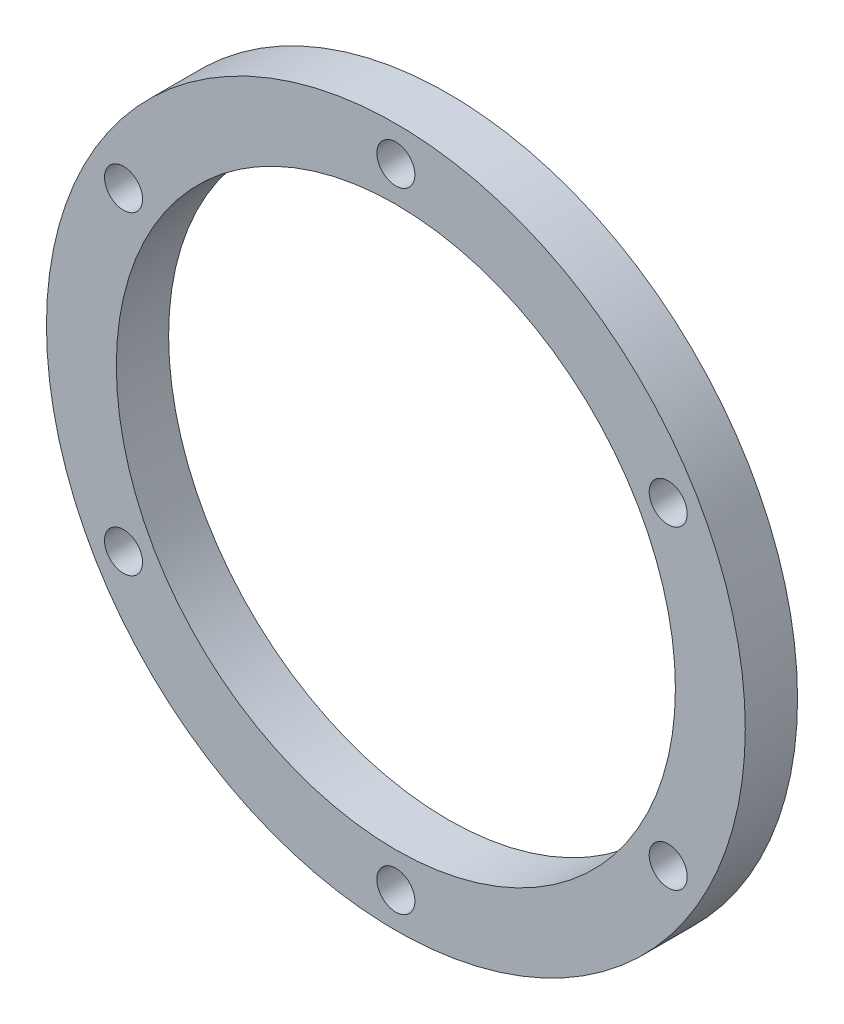
ISO-10303-21;
HEADER;
FILE_DESCRIPTION(('STEP AP214'),'2;1');
FILE_NAME('part.step','',(''),(''),'','','');
FILE_SCHEMA(('AUTOMOTIVE_DESIGN { 1 0 10303 214 1 1 1 1 }'));
ENDSEC;
DATA;
#1=APPLICATION_CONTEXT('core data for automotive mechanical design processes');
#2=APPLICATION_PROTOCOL_DEFINITION('international standard','automotive_design',2000,#1);
#3=PRODUCT_CONTEXT('',#1,'mechanical');
#4=PRODUCT('Part','Part','',(#3));
#5=PRODUCT_RELATED_PRODUCT_CATEGORY('part','',(#4));
#6=PRODUCT_DEFINITION_FORMATION('','',#4);
#7=PRODUCT_DEFINITION_CONTEXT('part definition',#1,'design');
#8=PRODUCT_DEFINITION('design','',#6,#7);
#9=PRODUCT_DEFINITION_SHAPE('','',#8);
#10=(LENGTH_UNIT() NAMED_UNIT(*) SI_UNIT(.MILLI.,.METRE.));
#11=(NAMED_UNIT(*) PLANE_ANGLE_UNIT() SI_UNIT($,.RADIAN.));
#12=(NAMED_UNIT(*) SI_UNIT($,.STERADIAN.) SOLID_ANGLE_UNIT());
#13=UNCERTAINTY_MEASURE_WITH_UNIT(LENGTH_MEASURE(1.E-05),#10,'distance_accuracy_value','');
#14=(GEOMETRIC_REPRESENTATION_CONTEXT(3) GLOBAL_UNCERTAINTY_ASSIGNED_CONTEXT((#13)) GLOBAL_UNIT_ASSIGNED_CONTEXT((#10,
#11,#12)) REPRESENTATION_CONTEXT('',''));
#15=CARTESIAN_POINT('',(0.,0.,0.));
#16=DIRECTION('',(0.,0.,1.));
#17=DIRECTION('',(1.,0.,0.));
#18=AXIS2_PLACEMENT_3D('',#15,#16,#17);
#19=CARTESIAN_POINT('',(0.,0.,4.7498));
#20=DIRECTION('',(0.,0.,1.));
#21=DIRECTION('',(1.,0.,0.));
#22=AXIS2_PLACEMENT_3D('',#19,#20,#21);
#23=PLANE('',#22);
#24=CARTESIAN_POINT('',(0.,28.575,4.7498));
#25=DIRECTION('',(0.,0.,1.));
#26=DIRECTION('',(1.,0.,0.));
#27=AXIS2_PLACEMENT_3D('',#24,#25,#26);
#28=CIRCLE('',#27,1.72719999999999);
#29=CARTESIAN_POINT('',(1.72719999999999,28.575,4.7498));
#30=VERTEX_POINT('',#29);
#31=EDGE_CURVE('E83',#30,#30,#28,.T.);
#32=ORIENTED_EDGE('',*,*,#31,.F.);
#33=EDGE_LOOP('',(#32));
#34=FACE_BOUND('',#33,.T.);
#35=CARTESIAN_POINT('',(24.7466759131404,14.2874999999999,4.7498));
#36=DIRECTION('',(0.,0.,1.));
#37=DIRECTION('',(1.,0.,0.));
#38=AXIS2_PLACEMENT_3D('',#35,#36,#37);
#39=CIRCLE('',#38,1.72719999999999);
#40=CARTESIAN_POINT('',(26.4738759131404,14.2874999999999,4.7498));
#41=VERTEX_POINT('',#40);
#42=EDGE_CURVE('E77',#41,#41,#39,.T.);
#43=ORIENTED_EDGE('',*,*,#42,.F.);
#44=EDGE_LOOP('',(#43));
#45=FACE_BOUND('',#44,.T.);
#46=CARTESIAN_POINT('',(24.7466759131403,-14.2875000000001,4.7498));
#47=DIRECTION('',(0.,0.,1.));
#48=DIRECTION('',(1.,0.,0.));
#49=AXIS2_PLACEMENT_3D('',#46,#47,#48);
#50=CIRCLE('',#49,1.72719999999999);
#51=CARTESIAN_POINT('',(26.4738759131403,-14.2875000000001,4.7498));
#52=VERTEX_POINT('',#51);
#53=EDGE_CURVE('E71',#52,#52,#50,.T.);
#54=ORIENTED_EDGE('',*,*,#53,.F.);
#55=EDGE_LOOP('',(#54));
#56=FACE_BOUND('',#55,.T.);
#57=CARTESIAN_POINT('',(-1.99538274087401E-13,-28.575,4.7498));
#58=DIRECTION('',(0.,0.,1.));
#59=DIRECTION('',(1.,0.,0.));
#60=AXIS2_PLACEMENT_3D('',#57,#58,#59);
#61=CIRCLE('',#60,1.72719999999999);
#62=CARTESIAN_POINT('',(1.72719999999979,-28.575,4.7498));
#63=VERTEX_POINT('',#62);
#64=EDGE_CURVE('E65',#63,#63,#61,.T.);
#65=ORIENTED_EDGE('',*,*,#64,.F.);
#66=EDGE_LOOP('',(#65));
#67=FACE_BOUND('',#66,.T.);
#68=CARTESIAN_POINT('',(-24.7466759131405,-14.2874999999998,4.7498));
#69=DIRECTION('',(0.,0.,1.));
#70=DIRECTION('',(1.,0.,0.));
#71=AXIS2_PLACEMENT_3D('',#68,#69,#70);
#72=CIRCLE('',#71,1.72719999999999);
#73=CARTESIAN_POINT('',(-23.0194759131405,-14.2874999999998,4.7498));
#74=VERTEX_POINT('',#73);
#75=EDGE_CURVE('E59',#74,#74,#72,.T.);
#76=ORIENTED_EDGE('',*,*,#75,.F.);
#77=EDGE_LOOP('',(#76));
#78=FACE_BOUND('',#77,.T.);
#79=CARTESIAN_POINT('',(-24.7466759131402,14.2875000000003,4.7498));
#80=DIRECTION('',(0.,0.,1.));
#81=DIRECTION('',(1.,0.,0.));
#82=AXIS2_PLACEMENT_3D('',#79,#80,#81);
#83=CIRCLE('',#82,1.72719999999999);
#84=CARTESIAN_POINT('',(-23.0194759131402,14.2875000000003,4.7498));
#85=VERTEX_POINT('',#84);
#86=EDGE_CURVE('E53',#85,#85,#83,.T.);
#87=ORIENTED_EDGE('',*,*,#86,.F.);
#88=EDGE_LOOP('',(#87));
#89=FACE_BOUND('',#88,.T.);
#90=CARTESIAN_POINT('',(0.,0.,4.7498));
#91=DIRECTION('',(0.,0.,1.));
#92=DIRECTION('',(1.,0.,0.));
#93=AXIS2_PLACEMENT_3D('',#90,#91,#92);
#94=CIRCLE('',#93,31.75);
#95=CARTESIAN_POINT('',(31.75,0.,4.7498));
#96=VERTEX_POINT('',#95);
#97=EDGE_CURVE('E10',#96,#96,#94,.T.);
#98=ORIENTED_EDGE('',*,*,#97,.T.);
#99=EDGE_LOOP('',(#98));
#100=FACE_BOUND('',#99,.T.);
#101=CARTESIAN_POINT('',(0.,0.,4.7498));
#102=DIRECTION('',(0.,0.,1.));
#103=DIRECTION('',(1.,0.,0.));
#104=AXIS2_PLACEMENT_3D('',#101,#102,#103);
#105=CIRCLE('',#104,25.4);
#106=CARTESIAN_POINT('',(25.4,0.,4.7498));
#107=VERTEX_POINT('',#106);
#108=EDGE_CURVE('E43',#107,#107,#105,.T.);
#109=ORIENTED_EDGE('',*,*,#108,.F.);
#110=EDGE_LOOP('',(#109));
#111=FACE_BOUND('',#110,.T.);
#112=ADVANCED_FACE('F32',(#34,#45,#56,#67,#78,#89,#100,#111),#23,.T.);
#113=CARTESIAN_POINT('',(0.,0.,0.));
#114=DIRECTION('',(0.,0.,1.));
#115=DIRECTION('',(1.,0.,0.));
#116=AXIS2_PLACEMENT_3D('',#113,#114,#115);
#117=PLANE('',#116);
#118=CARTESIAN_POINT('',(0.,28.575,0.));
#119=DIRECTION('',(0.,0.,1.));
#120=DIRECTION('',(1.,0.,0.));
#121=AXIS2_PLACEMENT_3D('',#118,#119,#120);
#122=CIRCLE('',#121,1.7272);
#123=CARTESIAN_POINT('',(1.7272,28.575,0.));
#124=VERTEX_POINT('',#123);
#125=EDGE_CURVE('E80',#124,#124,#122,.T.);
#126=ORIENTED_EDGE('',*,*,#125,.T.);
#127=EDGE_LOOP('',(#126));
#128=FACE_BOUND('',#127,.T.);
#129=CARTESIAN_POINT('',(24.7466759131404,14.2874999999999,0.));
#130=DIRECTION('',(0.,0.,1.));
#131=DIRECTION('',(1.,0.,0.));
#132=AXIS2_PLACEMENT_3D('',#129,#130,#131);
#133=CIRCLE('',#132,1.7272);
#134=CARTESIAN_POINT('',(26.4738759131404,14.2874999999999,0.));
#135=VERTEX_POINT('',#134);
#136=EDGE_CURVE('E74',#135,#135,#133,.T.);
#137=ORIENTED_EDGE('',*,*,#136,.T.);
#138=EDGE_LOOP('',(#137));
#139=FACE_BOUND('',#138,.T.);
#140=CARTESIAN_POINT('',(24.7466759131403,-14.2875000000001,0.));
#141=DIRECTION('',(0.,0.,1.));
#142=DIRECTION('',(1.,0.,0.));
#143=AXIS2_PLACEMENT_3D('',#140,#141,#142);
#144=CIRCLE('',#143,1.7272);
#145=CARTESIAN_POINT('',(26.4738759131403,-14.2875000000001,0.));
#146=VERTEX_POINT('',#145);
#147=EDGE_CURVE('E68',#146,#146,#144,.T.);
#148=ORIENTED_EDGE('',*,*,#147,.T.);
#149=EDGE_LOOP('',(#148));
#150=FACE_BOUND('',#149,.T.);
#151=CARTESIAN_POINT('',(-1.99538274087401E-13,-28.575,0.));
#152=DIRECTION('',(0.,0.,1.));
#153=DIRECTION('',(1.,0.,0.));
#154=AXIS2_PLACEMENT_3D('',#151,#152,#153);
#155=CIRCLE('',#154,1.7272);
#156=CARTESIAN_POINT('',(1.7271999999998,-28.575,0.));
#157=VERTEX_POINT('',#156);
#158=EDGE_CURVE('E62',#157,#157,#155,.T.);
#159=ORIENTED_EDGE('',*,*,#158,.T.);
#160=EDGE_LOOP('',(#159));
#161=FACE_BOUND('',#160,.T.);
#162=CARTESIAN_POINT('',(-24.7466759131405,-14.2874999999998,0.));
#163=DIRECTION('',(0.,0.,1.));
#164=DIRECTION('',(1.,0.,0.));
#165=AXIS2_PLACEMENT_3D('',#162,#163,#164);
#166=CIRCLE('',#165,1.7272);
#167=CARTESIAN_POINT('',(-23.0194759131405,-14.2874999999998,0.));
#168=VERTEX_POINT('',#167);
#169=EDGE_CURVE('E56',#168,#168,#166,.T.);
#170=ORIENTED_EDGE('',*,*,#169,.T.);
#171=EDGE_LOOP('',(#170));
#172=FACE_BOUND('',#171,.T.);
#173=CARTESIAN_POINT('',(-24.7466759131402,14.2875000000003,0.));
#174=DIRECTION('',(0.,0.,1.));
#175=DIRECTION('',(1.,0.,0.));
#176=AXIS2_PLACEMENT_3D('',#173,#174,#175);
#177=CIRCLE('',#176,1.7272);
#178=CARTESIAN_POINT('',(-23.0194759131402,14.2875000000003,0.));
#179=VERTEX_POINT('',#178);
#180=EDGE_CURVE('E48',#179,#179,#177,.T.);
#181=ORIENTED_EDGE('',*,*,#180,.T.);
#182=EDGE_LOOP('',(#181));
#183=FACE_BOUND('',#182,.T.);
#184=CARTESIAN_POINT('',(0.,0.,0.));
#185=DIRECTION('',(0.,0.,1.));
#186=DIRECTION('',(1.,0.,0.));
#187=AXIS2_PLACEMENT_3D('',#184,#185,#186);
#188=CIRCLE('',#187,31.75);
#189=CARTESIAN_POINT('',(31.75,0.,0.));
#190=VERTEX_POINT('',#189);
#191=EDGE_CURVE('E36',#190,#190,#188,.T.);
#192=ORIENTED_EDGE('',*,*,#191,.F.);
#193=EDGE_LOOP('',(#192));
#194=FACE_BOUND('',#193,.T.);
#195=CARTESIAN_POINT('',(0.,0.,0.));
#196=DIRECTION('',(0.,0.,1.));
#197=DIRECTION('',(1.,0.,0.));
#198=AXIS2_PLACEMENT_3D('',#195,#196,#197);
#199=CIRCLE('',#198,25.4);
#200=CARTESIAN_POINT('',(25.4,0.,0.));
#201=VERTEX_POINT('',#200);
#202=EDGE_CURVE('E45',#201,#201,#199,.T.);
#203=ORIENTED_EDGE('',*,*,#202,.T.);
#204=EDGE_LOOP('',(#203));
#205=FACE_BOUND('',#204,.T.);
#206=ADVANCED_FACE('F91',(#128,#139,#150,#161,#172,#183,#194,#205),#117,.F.);
#207=CARTESIAN_POINT('',(0.,0.,4.7498));
#208=DIRECTION('',(0.,0.,-1.));
#209=DIRECTION('',(-1.,0.,0.));
#210=AXIS2_PLACEMENT_3D('',#207,#208,#209);
#211=CYLINDRICAL_SURFACE('',#210,31.75);
#212=ORIENTED_EDGE('',*,*,#97,.F.);
#213=EDGE_LOOP('',(#212));
#214=FACE_BOUND('',#213,.T.);
#215=ORIENTED_EDGE('',*,*,#191,.T.);
#216=EDGE_LOOP('',(#215));
#217=FACE_BOUND('',#216,.T.);
#218=ADVANCED_FACE('F34',(#214,#217),#211,.T.);
#219=CARTESIAN_POINT('',(0.,0.,4.7498));
#220=DIRECTION('',(0.,0.,-1.));
#221=DIRECTION('',(-1.,0.,0.));
#222=AXIS2_PLACEMENT_3D('',#219,#220,#221);
#223=CYLINDRICAL_SURFACE('',#222,25.4);
#224=ORIENTED_EDGE('',*,*,#108,.T.);
#225=EDGE_LOOP('',(#224));
#226=FACE_BOUND('',#225,.T.);
#227=ORIENTED_EDGE('',*,*,#202,.F.);
#228=EDGE_LOOP('',(#227));
#229=FACE_BOUND('',#228,.T.);
#230=ADVANCED_FACE('F105',(#226,#229),#223,.F.);
#231=CARTESIAN_POINT('',(-24.7466759131402,14.2875000000003,4.7498));
#232=DIRECTION('',(0.,0.,1.));
#233=DIRECTION('',(1.,0.,0.));
#234=AXIS2_PLACEMENT_3D('',#231,#232,#233);
#235=CYLINDRICAL_SURFACE('',#234,1.72719999999999);
#236=ORIENTED_EDGE('',*,*,#180,.F.);
#237=EDGE_LOOP('',(#236));
#238=FACE_BOUND('',#237,.T.);
#239=ORIENTED_EDGE('',*,*,#86,.T.);
#240=EDGE_LOOP('',(#239));
#241=FACE_BOUND('',#240,.T.);
#242=ADVANCED_FACE('F108',(#238,#241),#235,.F.);
#243=CARTESIAN_POINT('',(-24.7466759131405,-14.2874999999998,4.7498));
#244=DIRECTION('',(0.,0.,1.));
#245=DIRECTION('',(1.,0.,0.));
#246=AXIS2_PLACEMENT_3D('',#243,#244,#245);
#247=CYLINDRICAL_SURFACE('',#246,1.72719999999999);
#248=ORIENTED_EDGE('',*,*,#169,.F.);
#249=EDGE_LOOP('',(#248));
#250=FACE_BOUND('',#249,.T.);
#251=ORIENTED_EDGE('',*,*,#75,.T.);
#252=EDGE_LOOP('',(#251));
#253=FACE_BOUND('',#252,.T.);
#254=ADVANCED_FACE('F122',(#250,#253),#247,.F.);
#255=CARTESIAN_POINT('',(-1.99538274087401E-13,-28.575,4.7498));
#256=DIRECTION('',(0.,0.,1.));
#257=DIRECTION('',(1.,0.,0.));
#258=AXIS2_PLACEMENT_3D('',#255,#256,#257);
#259=CYLINDRICAL_SURFACE('',#258,1.72719999999999);
#260=ORIENTED_EDGE('',*,*,#158,.F.);
#261=EDGE_LOOP('',(#260));
#262=FACE_BOUND('',#261,.T.);
#263=ORIENTED_EDGE('',*,*,#64,.T.);
#264=EDGE_LOOP('',(#263));
#265=FACE_BOUND('',#264,.T.);
#266=ADVANCED_FACE('F126',(#262,#265),#259,.F.);
#267=CARTESIAN_POINT('',(24.7466759131403,-14.2875000000001,4.7498));
#268=DIRECTION('',(0.,0.,1.));
#269=DIRECTION('',(1.,0.,0.));
#270=AXIS2_PLACEMENT_3D('',#267,#268,#269);
#271=CYLINDRICAL_SURFACE('',#270,1.72719999999999);
#272=ORIENTED_EDGE('',*,*,#147,.F.);
#273=EDGE_LOOP('',(#272));
#274=FACE_BOUND('',#273,.T.);
#275=ORIENTED_EDGE('',*,*,#53,.T.);
#276=EDGE_LOOP('',(#275));
#277=FACE_BOUND('',#276,.T.);
#278=ADVANCED_FACE('F130',(#274,#277),#271,.F.);
#279=CARTESIAN_POINT('',(24.7466759131404,14.2874999999999,4.7498));
#280=DIRECTION('',(0.,0.,1.));
#281=DIRECTION('',(1.,0.,0.));
#282=AXIS2_PLACEMENT_3D('',#279,#280,#281);
#283=CYLINDRICAL_SURFACE('',#282,1.72719999999999);
#284=ORIENTED_EDGE('',*,*,#136,.F.);
#285=EDGE_LOOP('',(#284));
#286=FACE_BOUND('',#285,.T.);
#287=ORIENTED_EDGE('',*,*,#42,.T.);
#288=EDGE_LOOP('',(#287));
#289=FACE_BOUND('',#288,.T.);
#290=ADVANCED_FACE('F134',(#286,#289),#283,.F.);
#291=CARTESIAN_POINT('',(0.,28.575,4.7498));
#292=DIRECTION('',(0.,0.,1.));
#293=DIRECTION('',(1.,0.,0.));
#294=AXIS2_PLACEMENT_3D('',#291,#292,#293);
#295=CYLINDRICAL_SURFACE('',#294,1.72719999999999);
#296=ORIENTED_EDGE('',*,*,#125,.F.);
#297=EDGE_LOOP('',(#296));
#298=FACE_BOUND('',#297,.T.);
#299=ORIENTED_EDGE('',*,*,#31,.T.);
#300=EDGE_LOOP('',(#299));
#301=FACE_BOUND('',#300,.T.);
#302=ADVANCED_FACE('F87',(#298,#301),#295,.F.);
#303=CLOSED_SHELL('',(#112,#206,#218,#230,#242,#254,#266,#278,#290,#302));
#304=MANIFOLD_SOLID_BREP('B2',#303);
#305=ADVANCED_BREP_SHAPE_REPRESENTATION('',(#18,#304),#14);
#306=SHAPE_DEFINITION_REPRESENTATION(#9,#305);
ENDSEC;
END-ISO-10303-21;
